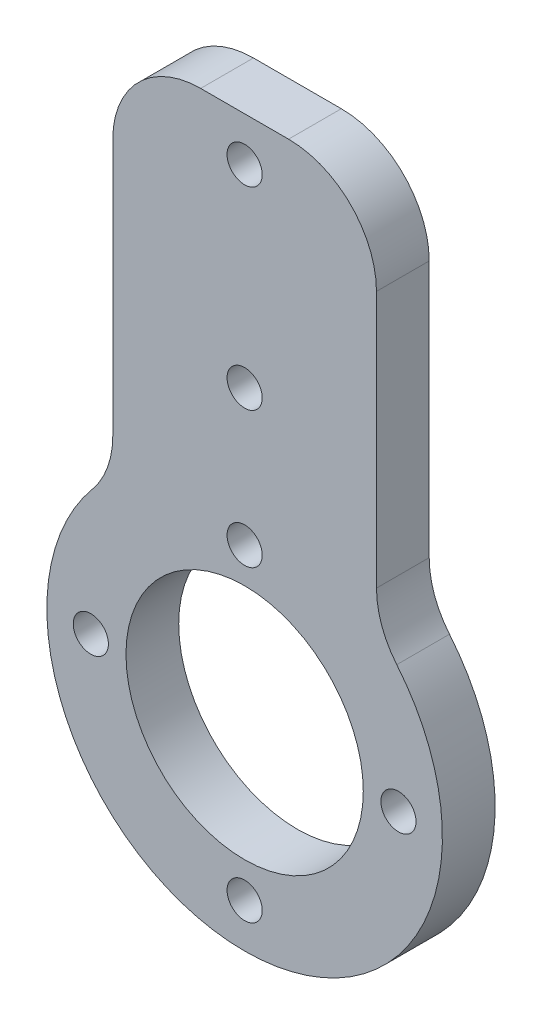
ISO-10303-21;
HEADER;
FILE_DESCRIPTION(('STEP AP214'),'2;1');
FILE_NAME('part.step','',(''),(''),'','','');
FILE_SCHEMA(('AUTOMOTIVE_DESIGN { 1 0 10303 214 1 1 1 1 }'));
ENDSEC;
DATA;
#1=APPLICATION_CONTEXT('core data for automotive mechanical design processes');
#2=APPLICATION_PROTOCOL_DEFINITION('international standard','automotive_design',2000,#1);
#3=PRODUCT_CONTEXT('',#1,'mechanical');
#4=PRODUCT('Part','Part','',(#3));
#5=PRODUCT_RELATED_PRODUCT_CATEGORY('part','',(#4));
#6=PRODUCT_DEFINITION_FORMATION('','',#4);
#7=PRODUCT_DEFINITION_CONTEXT('part definition',#1,'design');
#8=PRODUCT_DEFINITION('design','',#6,#7);
#9=PRODUCT_DEFINITION_SHAPE('','',#8);
#10=(LENGTH_UNIT() NAMED_UNIT(*) SI_UNIT(.MILLI.,.METRE.));
#11=(NAMED_UNIT(*) PLANE_ANGLE_UNIT() SI_UNIT($,.RADIAN.));
#12=(NAMED_UNIT(*) SI_UNIT($,.STERADIAN.) SOLID_ANGLE_UNIT());
#13=UNCERTAINTY_MEASURE_WITH_UNIT(LENGTH_MEASURE(1.E-05),#10,'distance_accuracy_value','');
#14=(GEOMETRIC_REPRESENTATION_CONTEXT(3) GLOBAL_UNCERTAINTY_ASSIGNED_CONTEXT((#13)) GLOBAL_UNIT_ASSIGNED_CONTEXT((#10,
#11,#12)) REPRESENTATION_CONTEXT('',''));
#15=CARTESIAN_POINT('',(0.,0.,0.));
#16=DIRECTION('',(0.,0.,1.));
#17=DIRECTION('',(1.,0.,0.));
#18=AXIS2_PLACEMENT_3D('',#15,#16,#17);
#19=CARTESIAN_POINT('',(-15.,0.,3.));
#20=DIRECTION('',(1.,0.,0.));
#21=DIRECTION('',(0.,1.,0.));
#22=AXIS2_PLACEMENT_3D('',#19,#20,#21);
#23=PLANE('',#22);
#24=DIRECTION('',(0.,-1.,0.));
#25=VECTOR('',#24,1.);
#26=CARTESIAN_POINT('',(-15.,0.,3.));
#27=LINE('',#26,#25);
#28=CARTESIAN_POINT('',(-15.,50.,3.));
#29=VERTEX_POINT('',#28);
#30=CARTESIAN_POINT('',(-15.,20.7665596572952,3.));
#31=VERTEX_POINT('',#30);
#32=EDGE_CURVE('E199',#29,#31,#27,.T.);
#33=ORIENTED_EDGE('',*,*,#32,.F.);
#34=DIRECTION('',(0.,0.,-1.));
#35=VECTOR('',#34,1.);
#36=CARTESIAN_POINT('',(-15.,50.,-3.));
#37=LINE('',#36,#35);
#38=CARTESIAN_POINT('',(-15.,50.,-3.));
#39=VERTEX_POINT('',#38);
#40=EDGE_CURVE('E169',#29,#39,#37,.T.);
#41=ORIENTED_EDGE('',*,*,#40,.T.);
#42=DIRECTION('',(0.,-1.,0.));
#43=VECTOR('',#42,1.);
#44=CARTESIAN_POINT('',(-15.,0.,-3.));
#45=LINE('',#44,#43);
#46=CARTESIAN_POINT('',(-15.,20.7665596572952,-3.));
#47=VERTEX_POINT('',#46);
#48=EDGE_CURVE('E116',#39,#47,#45,.T.);
#49=ORIENTED_EDGE('',*,*,#48,.T.);
#50=DIRECTION('',(0.,0.,1.));
#51=VECTOR('',#50,1.);
#52=CARTESIAN_POINT('',(-15.,20.7665596572952,3.));
#53=LINE('',#52,#51);
#54=EDGE_CURVE('E166',#47,#31,#53,.T.);
#55=ORIENTED_EDGE('',*,*,#54,.T.);
#56=EDGE_LOOP('',(#33,#41,#49,#55));
#57=FACE_BOUND('',#56,.T.);
#58=ADVANCED_FACE('F44',(#57),#23,.F.);
#59=CARTESIAN_POINT('',(0.,0.,3.));
#60=DIRECTION('',(0.,0.,-1.));
#61=DIRECTION('',(-1.,0.,0.));
#62=AXIS2_PLACEMENT_3D('',#59,#60,#61);
#63=CYLINDRICAL_SURFACE('',#62,22.5);
#64=CARTESIAN_POINT('',(0.,0.,-3.));
#65=DIRECTION('',(0.,0.,1.));
#66=DIRECTION('',(1.,0.,0.));
#67=AXIS2_PLACEMENT_3D('',#64,#65,#66);
#68=CIRCLE('',#67,22.5);
#69=CARTESIAN_POINT('',(-17.3076923076923,14.3768489935121,-3.));
#70=VERTEX_POINT('',#69);
#71=CARTESIAN_POINT('',(17.3076923076923,14.3768489935121,-3.));
#72=VERTEX_POINT('',#71);
#73=EDGE_CURVE('E185',#70,#72,#68,.T.);
#74=ORIENTED_EDGE('',*,*,#73,.T.);
#75=DIRECTION('',(0.,0.,-1.));
#76=VECTOR('',#75,1.);
#77=CARTESIAN_POINT('',(17.3076923076923,14.3768489935121,3.));
#78=LINE('',#77,#76);
#79=CARTESIAN_POINT('',(17.3076923076923,14.3768489935121,3.));
#80=VERTEX_POINT('',#79);
#81=EDGE_CURVE('E60',#72,#80,#78,.F.);
#82=ORIENTED_EDGE('',*,*,#81,.T.);
#83=CARTESIAN_POINT('',(0.,0.,3.));
#84=DIRECTION('',(0.,0.,1.));
#85=DIRECTION('',(1.,0.,0.));
#86=AXIS2_PLACEMENT_3D('',#83,#84,#85);
#87=CIRCLE('',#86,22.5);
#88=CARTESIAN_POINT('',(-17.3076923076923,14.3768489935121,3.));
#89=VERTEX_POINT('',#88);
#90=EDGE_CURVE('E195',#89,#80,#87,.T.);
#91=ORIENTED_EDGE('',*,*,#90,.F.);
#92=DIRECTION('',(0.,0.,-1.));
#93=VECTOR('',#92,1.);
#94=CARTESIAN_POINT('',(-17.3076923076923,14.3768489935121,3.));
#95=LINE('',#94,#93);
#96=EDGE_CURVE('E172',#89,#70,#95,.T.);
#97=ORIENTED_EDGE('',*,*,#96,.T.);
#98=EDGE_LOOP('',(#74,#82,#91,#97));
#99=FACE_BOUND('',#98,.T.);
#100=ADVANCED_FACE('F194',(#99),#63,.T.);
#101=CARTESIAN_POINT('',(15.,0.,3.));
#102=DIRECTION('',(1.,0.,0.));
#103=DIRECTION('',(0.,1.,0.));
#104=AXIS2_PLACEMENT_3D('',#101,#102,#103);
#105=PLANE('',#104);
#106=DIRECTION('',(0.,-1.,0.));
#107=VECTOR('',#106,1.);
#108=CARTESIAN_POINT('',(15.,0.,-3.));
#109=LINE('',#108,#107);
#110=CARTESIAN_POINT('',(15.,50.,-3.));
#111=VERTEX_POINT('',#110);
#112=CARTESIAN_POINT('',(15.,20.7665596572952,-3.));
#113=VERTEX_POINT('',#112);
#114=EDGE_CURVE('E134',#111,#113,#109,.T.);
#115=ORIENTED_EDGE('',*,*,#114,.F.);
#116=DIRECTION('',(0.,0.,-1.));
#117=VECTOR('',#116,1.);
#118=CARTESIAN_POINT('',(15.,50.,3.));
#119=LINE('',#118,#117);
#120=CARTESIAN_POINT('',(15.,50.,3.));
#121=VERTEX_POINT('',#120);
#122=EDGE_CURVE('E158',#111,#121,#119,.F.);
#123=ORIENTED_EDGE('',*,*,#122,.T.);
#124=DIRECTION('',(0.,-1.,0.));
#125=VECTOR('',#124,1.);
#126=CARTESIAN_POINT('',(15.,0.,3.));
#127=LINE('',#126,#125);
#128=CARTESIAN_POINT('',(15.,20.7665596572952,3.));
#129=VERTEX_POINT('',#128);
#130=EDGE_CURVE('E198',#121,#129,#127,.T.);
#131=ORIENTED_EDGE('',*,*,#130,.T.);
#132=DIRECTION('',(0.,0.,-1.));
#133=VECTOR('',#132,1.);
#134=CARTESIAN_POINT('',(15.,20.7665596572952,3.));
#135=LINE('',#134,#133);
#136=EDGE_CURVE('E154',#129,#113,#135,.T.);
#137=ORIENTED_EDGE('',*,*,#136,.T.);
#138=EDGE_LOOP('',(#115,#123,#131,#137));
#139=FACE_BOUND('',#138,.T.);
#140=ADVANCED_FACE('F304',(#139),#105,.T.);
#141=CARTESIAN_POINT('',(0.,17.5,3.));
#142=DIRECTION('',(0.,0.,-1.));
#143=DIRECTION('',(-1.,0.,0.));
#144=AXIS2_PLACEMENT_3D('',#141,#142,#143);
#145=CYLINDRICAL_SURFACE('',#144,2.);
#146=CARTESIAN_POINT('',(0.,17.5,3.));
#147=DIRECTION('',(0.,0.,1.));
#148=DIRECTION('',(1.,0.,0.));
#149=AXIS2_PLACEMENT_3D('',#146,#147,#148);
#150=CIRCLE('',#149,2.);
#151=CARTESIAN_POINT('',(2.,17.5,3.));
#152=VERTEX_POINT('',#151);
#153=EDGE_CURVE('E146',#152,#152,#150,.T.);
#154=ORIENTED_EDGE('',*,*,#153,.T.);
#155=EDGE_LOOP('',(#154));
#156=FACE_BOUND('',#155,.T.);
#157=CARTESIAN_POINT('',(0.,17.5,-3.));
#158=DIRECTION('',(0.,0.,1.));
#159=DIRECTION('',(1.,0.,0.));
#160=AXIS2_PLACEMENT_3D('',#157,#158,#159);
#161=CIRCLE('',#160,2.);
#162=CARTESIAN_POINT('',(2.,17.5,-3.));
#163=VERTEX_POINT('',#162);
#164=EDGE_CURVE('E249',#163,#163,#161,.T.);
#165=ORIENTED_EDGE('',*,*,#164,.F.);
#166=EDGE_LOOP('',(#165));
#167=FACE_BOUND('',#166,.T.);
#168=ADVANCED_FACE('F326',(#156,#167),#145,.F.);
#169=CARTESIAN_POINT('',(17.5,0.,3.));
#170=DIRECTION('',(0.,0.,-1.));
#171=DIRECTION('',(-1.,0.,0.));
#172=AXIS2_PLACEMENT_3D('',#169,#170,#171);
#173=CYLINDRICAL_SURFACE('',#172,2.);
#174=CARTESIAN_POINT('',(17.5,0.,3.));
#175=DIRECTION('',(0.,0.,1.));
#176=DIRECTION('',(1.,0.,0.));
#177=AXIS2_PLACEMENT_3D('',#174,#175,#176);
#178=CIRCLE('',#177,2.);
#179=CARTESIAN_POINT('',(19.5,0.,3.));
#180=VERTEX_POINT('',#179);
#181=EDGE_CURVE('E220',#180,#180,#178,.T.);
#182=ORIENTED_EDGE('',*,*,#181,.T.);
#183=EDGE_LOOP('',(#182));
#184=FACE_BOUND('',#183,.T.);
#185=CARTESIAN_POINT('',(17.5,0.,-3.));
#186=DIRECTION('',(0.,0.,1.));
#187=DIRECTION('',(1.,0.,0.));
#188=AXIS2_PLACEMENT_3D('',#185,#186,#187);
#189=CIRCLE('',#188,2.);
#190=CARTESIAN_POINT('',(19.5,0.,-3.));
#191=VERTEX_POINT('',#190);
#192=EDGE_CURVE('E246',#191,#191,#189,.T.);
#193=ORIENTED_EDGE('',*,*,#192,.F.);
#194=EDGE_LOOP('',(#193));
#195=FACE_BOUND('',#194,.T.);
#196=ADVANCED_FACE('F330',(#184,#195),#173,.F.);
#197=CARTESIAN_POINT('',(0.,-17.5,3.));
#198=DIRECTION('',(0.,0.,-1.));
#199=DIRECTION('',(-1.,0.,0.));
#200=AXIS2_PLACEMENT_3D('',#197,#198,#199);
#201=CYLINDRICAL_SURFACE('',#200,2.);
#202=CARTESIAN_POINT('',(0.,-17.5,3.));
#203=DIRECTION('',(0.,0.,1.));
#204=DIRECTION('',(1.,0.,0.));
#205=AXIS2_PLACEMENT_3D('',#202,#203,#204);
#206=CIRCLE('',#205,2.);
#207=CARTESIAN_POINT('',(2.,-17.5,3.));
#208=VERTEX_POINT('',#207);
#209=EDGE_CURVE('E216',#208,#208,#206,.T.);
#210=ORIENTED_EDGE('',*,*,#209,.T.);
#211=EDGE_LOOP('',(#210));
#212=FACE_BOUND('',#211,.T.);
#213=CARTESIAN_POINT('',(0.,-17.5,-3.));
#214=DIRECTION('',(0.,0.,1.));
#215=DIRECTION('',(1.,0.,0.));
#216=AXIS2_PLACEMENT_3D('',#213,#214,#215);
#217=CIRCLE('',#216,2.);
#218=CARTESIAN_POINT('',(2.,-17.5,-3.));
#219=VERTEX_POINT('',#218);
#220=EDGE_CURVE('E242',#219,#219,#217,.T.);
#221=ORIENTED_EDGE('',*,*,#220,.F.);
#222=EDGE_LOOP('',(#221));
#223=FACE_BOUND('',#222,.T.);
#224=ADVANCED_FACE('F338',(#212,#223),#201,.F.);
#225=CARTESIAN_POINT('',(-17.5,0.,3.));
#226=DIRECTION('',(0.,0.,-1.));
#227=DIRECTION('',(-1.,0.,0.));
#228=AXIS2_PLACEMENT_3D('',#225,#226,#227);
#229=CYLINDRICAL_SURFACE('',#228,2.);
#230=CARTESIAN_POINT('',(-17.5,0.,3.));
#231=DIRECTION('',(0.,0.,1.));
#232=DIRECTION('',(1.,0.,0.));
#233=AXIS2_PLACEMENT_3D('',#230,#231,#232);
#234=CIRCLE('',#233,2.);
#235=CARTESIAN_POINT('',(-15.5,0.,3.));
#236=VERTEX_POINT('',#235);
#237=EDGE_CURVE('E212',#236,#236,#234,.T.);
#238=ORIENTED_EDGE('',*,*,#237,.T.);
#239=EDGE_LOOP('',(#238));
#240=FACE_BOUND('',#239,.T.);
#241=CARTESIAN_POINT('',(-17.5,0.,-3.));
#242=DIRECTION('',(0.,0.,1.));
#243=DIRECTION('',(1.,0.,0.));
#244=AXIS2_PLACEMENT_3D('',#241,#242,#243);
#245=CIRCLE('',#244,2.);
#246=CARTESIAN_POINT('',(-15.5,0.,-3.));
#247=VERTEX_POINT('',#246);
#248=EDGE_CURVE('E133',#247,#247,#245,.T.);
#249=ORIENTED_EDGE('',*,*,#248,.F.);
#250=EDGE_LOOP('',(#249));
#251=FACE_BOUND('',#250,.T.);
#252=ADVANCED_FACE('F335',(#240,#251),#229,.F.);
#253=CARTESIAN_POINT('',(0.,60.,3.));
#254=DIRECTION('',(0.,1.,0.));
#255=DIRECTION('',(0.,0.,1.));
#256=AXIS2_PLACEMENT_3D('',#253,#254,#255);
#257=PLANE('',#256);
#258=DIRECTION('',(1.,0.,0.));
#259=VECTOR('',#258,1.);
#260=CARTESIAN_POINT('',(0.,60.,3.));
#261=LINE('',#260,#259);
#262=CARTESIAN_POINT('',(-5.,60.,3.));
#263=VERTEX_POINT('',#262);
#264=CARTESIAN_POINT('',(5.,60.,3.));
#265=VERTEX_POINT('',#264);
#266=EDGE_CURVE('E204',#263,#265,#261,.T.);
#267=ORIENTED_EDGE('',*,*,#266,.T.);
#268=DIRECTION('',(0.,0.,-1.));
#269=VECTOR('',#268,1.);
#270=CARTESIAN_POINT('',(5.,60.,3.));
#271=LINE('',#270,#269);
#272=CARTESIAN_POINT('',(5.,60.,-3.));
#273=VERTEX_POINT('',#272);
#274=EDGE_CURVE('E123',#265,#273,#271,.T.);
#275=ORIENTED_EDGE('',*,*,#274,.T.);
#276=DIRECTION('',(1.,0.,0.));
#277=VECTOR('',#276,1.);
#278=CARTESIAN_POINT('',(0.,60.,-3.));
#279=LINE('',#278,#277);
#280=CARTESIAN_POINT('',(-5.,60.,-3.));
#281=VERTEX_POINT('',#280);
#282=EDGE_CURVE('E114',#281,#273,#279,.T.);
#283=ORIENTED_EDGE('',*,*,#282,.F.);
#284=DIRECTION('',(0.,0.,-1.));
#285=VECTOR('',#284,1.);
#286=CARTESIAN_POINT('',(-5.,60.,3.));
#287=LINE('',#286,#285);
#288=EDGE_CURVE('E129',#281,#263,#287,.F.);
#289=ORIENTED_EDGE('',*,*,#288,.T.);
#290=EDGE_LOOP('',(#267,#275,#283,#289));
#291=FACE_BOUND('',#290,.T.);
#292=ADVANCED_FACE('F128',(#291),#257,.T.);
#293=CARTESIAN_POINT('',(0.,55.,3.));
#294=DIRECTION('',(0.,0.,-1.));
#295=DIRECTION('',(-1.,0.,0.));
#296=AXIS2_PLACEMENT_3D('',#293,#294,#295);
#297=CYLINDRICAL_SURFACE('',#296,2.);
#298=CARTESIAN_POINT('',(0.,55.,3.));
#299=DIRECTION('',(0.,0.,1.));
#300=DIRECTION('',(1.,0.,0.));
#301=AXIS2_PLACEMENT_3D('',#298,#299,#300);
#302=CIRCLE('',#301,2.);
#303=CARTESIAN_POINT('',(2.,55.,3.));
#304=VERTEX_POINT('',#303);
#305=EDGE_CURVE('E206',#304,#304,#302,.T.);
#306=ORIENTED_EDGE('',*,*,#305,.T.);
#307=EDGE_LOOP('',(#306));
#308=FACE_BOUND('',#307,.T.);
#309=CARTESIAN_POINT('',(0.,55.,-3.));
#310=DIRECTION('',(0.,0.,1.));
#311=DIRECTION('',(1.,0.,0.));
#312=AXIS2_PLACEMENT_3D('',#309,#310,#311);
#313=CIRCLE('',#312,2.);
#314=CARTESIAN_POINT('',(2.,55.,-3.));
#315=VERTEX_POINT('',#314);
#316=EDGE_CURVE('E192',#315,#315,#313,.T.);
#317=ORIENTED_EDGE('',*,*,#316,.F.);
#318=EDGE_LOOP('',(#317));
#319=FACE_BOUND('',#318,.T.);
#320=ADVANCED_FACE('F268',(#308,#319),#297,.F.);
#321=CARTESIAN_POINT('',(0.,33.,3.));
#322=DIRECTION('',(0.,0.,-1.));
#323=DIRECTION('',(-1.,0.,0.));
#324=AXIS2_PLACEMENT_3D('',#321,#322,#323);
#325=CYLINDRICAL_SURFACE('',#324,2.);
#326=CARTESIAN_POINT('',(0.,33.,3.));
#327=DIRECTION('',(0.,0.,1.));
#328=DIRECTION('',(1.,0.,0.));
#329=AXIS2_PLACEMENT_3D('',#326,#327,#328);
#330=CIRCLE('',#329,2.);
#331=CARTESIAN_POINT('',(2.,33.,3.));
#332=VERTEX_POINT('',#331);
#333=EDGE_CURVE('E256',#332,#332,#330,.T.);
#334=ORIENTED_EDGE('',*,*,#333,.T.);
#335=EDGE_LOOP('',(#334));
#336=FACE_BOUND('',#335,.T.);
#337=CARTESIAN_POINT('',(0.,33.,-3.));
#338=DIRECTION('',(0.,0.,1.));
#339=DIRECTION('',(1.,0.,0.));
#340=AXIS2_PLACEMENT_3D('',#337,#338,#339);
#341=CIRCLE('',#340,2.);
#342=CARTESIAN_POINT('',(2.,33.,-3.));
#343=VERTEX_POINT('',#342);
#344=EDGE_CURVE('E227',#343,#343,#341,.T.);
#345=ORIENTED_EDGE('',*,*,#344,.F.);
#346=EDGE_LOOP('',(#345));
#347=FACE_BOUND('',#346,.T.);
#348=ADVANCED_FACE('F291',(#336,#347),#325,.F.);
#349=CARTESIAN_POINT('',(0.,0.,3.));
#350=DIRECTION('',(0.,0.,-1.));
#351=DIRECTION('',(-1.,0.,0.));
#352=AXIS2_PLACEMENT_3D('',#349,#350,#351);
#353=CYLINDRICAL_SURFACE('',#352,13.5);
#354=CARTESIAN_POINT('',(0.,0.,3.));
#355=DIRECTION('',(0.,0.,1.));
#356=DIRECTION('',(1.,0.,0.));
#357=AXIS2_PLACEMENT_3D('',#354,#355,#356);
#358=CIRCLE('',#357,13.5);
#359=CARTESIAN_POINT('',(13.5,0.,3.));
#360=VERTEX_POINT('',#359);
#361=EDGE_CURVE('E140',#360,#360,#358,.T.);
#362=ORIENTED_EDGE('',*,*,#361,.T.);
#363=EDGE_LOOP('',(#362));
#364=FACE_BOUND('',#363,.T.);
#365=CARTESIAN_POINT('',(0.,0.,-3.));
#366=DIRECTION('',(0.,0.,1.));
#367=DIRECTION('',(1.,0.,0.));
#368=AXIS2_PLACEMENT_3D('',#365,#366,#367);
#369=CIRCLE('',#368,13.5);
#370=CARTESIAN_POINT('',(13.5,0.,-3.));
#371=VERTEX_POINT('',#370);
#372=EDGE_CURVE('E149',#371,#371,#369,.T.);
#373=ORIENTED_EDGE('',*,*,#372,.F.);
#374=EDGE_LOOP('',(#373));
#375=FACE_BOUND('',#374,.T.);
#376=ADVANCED_FACE('F273',(#364,#375),#353,.F.);
#377=CARTESIAN_POINT('',(0.,0.,3.));
#378=DIRECTION('',(0.,0.,1.));
#379=DIRECTION('',(1.,0.,0.));
#380=AXIS2_PLACEMENT_3D('',#377,#378,#379);
#381=PLANE('',#380);
#382=ORIENTED_EDGE('',*,*,#333,.F.);
#383=EDGE_LOOP('',(#382));
#384=FACE_BOUND('',#383,.T.);
#385=ORIENTED_EDGE('',*,*,#305,.F.);
#386=EDGE_LOOP('',(#385));
#387=FACE_BOUND('',#386,.T.);
#388=ORIENTED_EDGE('',*,*,#130,.F.);
#389=CARTESIAN_POINT('',(5.,50.,3.));
#390=DIRECTION('',(0.,0.,1.));
#391=DIRECTION('',(1.,0.,0.));
#392=AXIS2_PLACEMENT_3D('',#389,#390,#391);
#393=CIRCLE('',#392,10.);
#394=EDGE_CURVE('E163',#121,#265,#393,.T.);
#395=ORIENTED_EDGE('',*,*,#394,.T.);
#396=ORIENTED_EDGE('',*,*,#266,.F.);
#397=CARTESIAN_POINT('',(-5.,50.,3.));
#398=DIRECTION('',(0.,0.,1.));
#399=DIRECTION('',(1.,0.,0.));
#400=AXIS2_PLACEMENT_3D('',#397,#398,#399);
#401=CIRCLE('',#400,10.);
#402=EDGE_CURVE('E138',#263,#29,#401,.T.);
#403=ORIENTED_EDGE('',*,*,#402,.T.);
#404=ORIENTED_EDGE('',*,*,#32,.T.);
#405=CARTESIAN_POINT('',(-25.,20.7665596572952,3.));
#406=DIRECTION('',(0.,0.,1.));
#407=DIRECTION('',(1.,0.,0.));
#408=AXIS2_PLACEMENT_3D('',#405,#406,#407);
#409=CIRCLE('',#408,10.);
#410=EDGE_CURVE('E11',#31,#89,#409,.F.);
#411=ORIENTED_EDGE('',*,*,#410,.T.);
#412=ORIENTED_EDGE('',*,*,#90,.T.);
#413=CARTESIAN_POINT('',(25.,20.7665596572952,3.));
#414=DIRECTION('',(0.,0.,1.));
#415=DIRECTION('',(1.,0.,0.));
#416=AXIS2_PLACEMENT_3D('',#413,#414,#415);
#417=CIRCLE('',#416,10.);
#418=EDGE_CURVE('E181',#80,#129,#417,.F.);
#419=ORIENTED_EDGE('',*,*,#418,.T.);
#420=EDGE_LOOP('',(#388,#395,#396,#403,#404,#411,#412,#419));
#421=FACE_BOUND('',#420,.T.);
#422=ORIENTED_EDGE('',*,*,#237,.F.);
#423=EDGE_LOOP('',(#422));
#424=FACE_BOUND('',#423,.T.);
#425=ORIENTED_EDGE('',*,*,#209,.F.);
#426=EDGE_LOOP('',(#425));
#427=FACE_BOUND('',#426,.T.);
#428=ORIENTED_EDGE('',*,*,#181,.F.);
#429=EDGE_LOOP('',(#428));
#430=FACE_BOUND('',#429,.T.);
#431=ORIENTED_EDGE('',*,*,#153,.F.);
#432=EDGE_LOOP('',(#431));
#433=FACE_BOUND('',#432,.T.);
#434=ORIENTED_EDGE('',*,*,#361,.F.);
#435=EDGE_LOOP('',(#434));
#436=FACE_BOUND('',#435,.T.);
#437=ADVANCED_FACE('F271',(#384,#387,#421,#424,#427,#430,#433,#436),#381,.T.);
#438=CARTESIAN_POINT('',(0.,0.,-3.));
#439=DIRECTION('',(0.,0.,1.));
#440=DIRECTION('',(1.,0.,0.));
#441=AXIS2_PLACEMENT_3D('',#438,#439,#440);
#442=PLANE('',#441);
#443=ORIENTED_EDGE('',*,*,#344,.T.);
#444=EDGE_LOOP('',(#443));
#445=FACE_BOUND('',#444,.T.);
#446=ORIENTED_EDGE('',*,*,#316,.T.);
#447=EDGE_LOOP('',(#446));
#448=FACE_BOUND('',#447,.T.);
#449=ORIENTED_EDGE('',*,*,#282,.T.);
#450=CARTESIAN_POINT('',(5.,50.,-3.));
#451=DIRECTION('',(0.,0.,1.));
#452=DIRECTION('',(1.,0.,0.));
#453=AXIS2_PLACEMENT_3D('',#450,#451,#452);
#454=CIRCLE('',#453,10.);
#455=EDGE_CURVE('E122',#273,#111,#454,.F.);
#456=ORIENTED_EDGE('',*,*,#455,.T.);
#457=ORIENTED_EDGE('',*,*,#114,.T.);
#458=CARTESIAN_POINT('',(25.,20.7665596572952,-3.));
#459=DIRECTION('',(0.,0.,1.));
#460=DIRECTION('',(1.,0.,0.));
#461=AXIS2_PLACEMENT_3D('',#458,#459,#460);
#462=CIRCLE('',#461,10.);
#463=EDGE_CURVE('E178',#113,#72,#462,.T.);
#464=ORIENTED_EDGE('',*,*,#463,.T.);
#465=ORIENTED_EDGE('',*,*,#73,.F.);
#466=CARTESIAN_POINT('',(-25.,20.7665596572952,-3.));
#467=DIRECTION('',(0.,0.,1.));
#468=DIRECTION('',(1.,0.,0.));
#469=AXIS2_PLACEMENT_3D('',#466,#467,#468);
#470=CIRCLE('',#469,10.);
#471=EDGE_CURVE('E53',#70,#47,#470,.T.);
#472=ORIENTED_EDGE('',*,*,#471,.T.);
#473=ORIENTED_EDGE('',*,*,#48,.F.);
#474=CARTESIAN_POINT('',(-5.,50.,-3.));
#475=DIRECTION('',(0.,0.,1.));
#476=DIRECTION('',(1.,0.,0.));
#477=AXIS2_PLACEMENT_3D('',#474,#475,#476);
#478=CIRCLE('',#477,10.);
#479=EDGE_CURVE('E110',#39,#281,#478,.F.);
#480=ORIENTED_EDGE('',*,*,#479,.T.);
#481=EDGE_LOOP('',(#449,#456,#457,#464,#465,#472,#473,#480));
#482=FACE_BOUND('',#481,.T.);
#483=ORIENTED_EDGE('',*,*,#248,.T.);
#484=EDGE_LOOP('',(#483));
#485=FACE_BOUND('',#484,.T.);
#486=ORIENTED_EDGE('',*,*,#220,.T.);
#487=EDGE_LOOP('',(#486));
#488=FACE_BOUND('',#487,.T.);
#489=ORIENTED_EDGE('',*,*,#192,.T.);
#490=EDGE_LOOP('',(#489));
#491=FACE_BOUND('',#490,.T.);
#492=ORIENTED_EDGE('',*,*,#164,.T.);
#493=EDGE_LOOP('',(#492));
#494=FACE_BOUND('',#493,.T.);
#495=ORIENTED_EDGE('',*,*,#372,.T.);
#496=EDGE_LOOP('',(#495));
#497=FACE_BOUND('',#496,.T.);
#498=ADVANCED_FACE('F112',(#445,#448,#482,#485,#488,#491,#494,#497),#442,.F.);
#499=CARTESIAN_POINT('',(5.,50.,3.));
#500=DIRECTION('',(0.,0.,-1.));
#501=DIRECTION('',(-1.,0.,0.));
#502=AXIS2_PLACEMENT_3D('',#499,#500,#501);
#503=CYLINDRICAL_SURFACE('',#502,10.);
#504=ORIENTED_EDGE('',*,*,#394,.F.);
#505=ORIENTED_EDGE('',*,*,#122,.F.);
#506=ORIENTED_EDGE('',*,*,#455,.F.);
#507=ORIENTED_EDGE('',*,*,#274,.F.);
#508=EDGE_LOOP('',(#504,#505,#506,#507));
#509=FACE_BOUND('',#508,.T.);
#510=ADVANCED_FACE('F310',(#509),#503,.T.);
#511=CARTESIAN_POINT('',(-5.,50.,3.));
#512=DIRECTION('',(0.,0.,1.));
#513=DIRECTION('',(1.,0.,0.));
#514=AXIS2_PLACEMENT_3D('',#511,#512,#513);
#515=CYLINDRICAL_SURFACE('',#514,10.);
#516=ORIENTED_EDGE('',*,*,#402,.F.);
#517=ORIENTED_EDGE('',*,*,#288,.F.);
#518=ORIENTED_EDGE('',*,*,#479,.F.);
#519=ORIENTED_EDGE('',*,*,#40,.F.);
#520=EDGE_LOOP('',(#516,#517,#518,#519));
#521=FACE_BOUND('',#520,.T.);
#522=ADVANCED_FACE('F137',(#521),#515,.T.);
#523=CARTESIAN_POINT('',(25.,20.7665596572952,3.));
#524=DIRECTION('',(0.,0.,-1.));
#525=DIRECTION('',(-1.,0.,0.));
#526=AXIS2_PLACEMENT_3D('',#523,#524,#525);
#527=CYLINDRICAL_SURFACE('',#526,10.);
#528=ORIENTED_EDGE('',*,*,#418,.F.);
#529=ORIENTED_EDGE('',*,*,#81,.F.);
#530=ORIENTED_EDGE('',*,*,#463,.F.);
#531=ORIENTED_EDGE('',*,*,#136,.F.);
#532=EDGE_LOOP('',(#528,#529,#530,#531));
#533=FACE_BOUND('',#532,.T.);
#534=ADVANCED_FACE('F315',(#533),#527,.F.);
#535=CARTESIAN_POINT('',(-25.,20.7665596572952,3.));
#536=DIRECTION('',(0.,0.,-1.));
#537=DIRECTION('',(-1.,0.,0.));
#538=AXIS2_PLACEMENT_3D('',#535,#536,#537);
#539=CYLINDRICAL_SURFACE('',#538,10.);
#540=ORIENTED_EDGE('',*,*,#410,.F.);
#541=ORIENTED_EDGE('',*,*,#54,.F.);
#542=ORIENTED_EDGE('',*,*,#471,.F.);
#543=ORIENTED_EDGE('',*,*,#96,.F.);
#544=EDGE_LOOP('',(#540,#541,#542,#543));
#545=FACE_BOUND('',#544,.T.);
#546=ADVANCED_FACE('F46',(#545),#539,.F.);
#547=CLOSED_SHELL('',(#58,#100,#140,#168,#196,#224,#252,#292,#320,#348,#376,#437,#498,#510,#522,
#534,#546));
#548=MANIFOLD_SOLID_BREP('B2',#547);
#549=ADVANCED_BREP_SHAPE_REPRESENTATION('',(#18,#548),#14);
#550=SHAPE_DEFINITION_REPRESENTATION(#9,#549);
ENDSEC;
END-ISO-10303-21;
